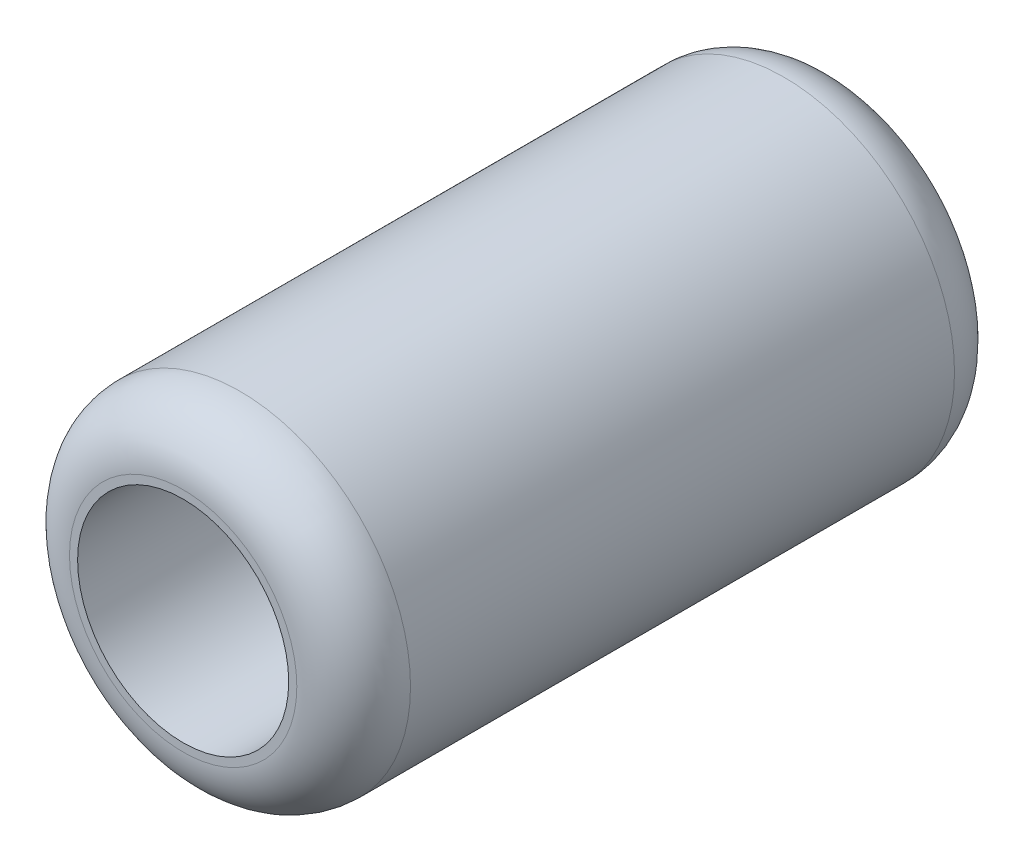
ISO-10303-21;
HEADER;
FILE_DESCRIPTION(('STEP AP214'),'2;1');
FILE_NAME('part.step','',(''),(''),'','','');
FILE_SCHEMA(('AUTOMOTIVE_DESIGN { 1 0 10303 214 1 1 1 1 }'));
ENDSEC;
DATA;
#1=APPLICATION_CONTEXT('core data for automotive mechanical design processes');
#2=APPLICATION_PROTOCOL_DEFINITION('international standard','automotive_design',2000,#1);
#3=PRODUCT_CONTEXT('',#1,'mechanical');
#4=PRODUCT('Part','Part','',(#3));
#5=PRODUCT_RELATED_PRODUCT_CATEGORY('part','',(#4));
#6=PRODUCT_DEFINITION_FORMATION('','',#4);
#7=PRODUCT_DEFINITION_CONTEXT('part definition',#1,'design');
#8=PRODUCT_DEFINITION('design','',#6,#7);
#9=PRODUCT_DEFINITION_SHAPE('','',#8);
#10=(LENGTH_UNIT() NAMED_UNIT(*) SI_UNIT(.MILLI.,.METRE.));
#11=(NAMED_UNIT(*) PLANE_ANGLE_UNIT() SI_UNIT($,.RADIAN.));
#12=(NAMED_UNIT(*) SI_UNIT($,.STERADIAN.) SOLID_ANGLE_UNIT());
#13=UNCERTAINTY_MEASURE_WITH_UNIT(LENGTH_MEASURE(1.E-05),#10,'distance_accuracy_value','');
#14=(GEOMETRIC_REPRESENTATION_CONTEXT(3) GLOBAL_UNCERTAINTY_ASSIGNED_CONTEXT((#13)) GLOBAL_UNIT_ASSIGNED_CONTEXT((#10,
#11,#12)) REPRESENTATION_CONTEXT('',''));
#15=CARTESIAN_POINT('',(0.,0.,0.));
#16=DIRECTION('',(0.,0.,1.));
#17=DIRECTION('',(1.,0.,0.));
#18=AXIS2_PLACEMENT_3D('',#15,#16,#17);
#19=CARTESIAN_POINT('',(0.,0.,40.5));
#20=DIRECTION('',(0.,0.,-1.));
#21=DIRECTION('',(-1.,0.,0.));
#22=AXIS2_PLACEMENT_3D('',#19,#20,#21);
#23=CYLINDRICAL_SURFACE('',#22,10.5);
#24=CARTESIAN_POINT('',(0.,0.,3.5));
#25=DIRECTION('',(0.,0.,1.));
#26=DIRECTION('',(1.,0.,0.));
#27=AXIS2_PLACEMENT_3D('',#24,#25,#26);
#28=CIRCLE('',#27,10.5);
#29=CARTESIAN_POINT('',(10.5,0.,3.5));
#30=VERTEX_POINT('',#29);
#31=EDGE_CURVE('E46',#30,#30,#28,.T.);
#32=ORIENTED_EDGE('',*,*,#31,.T.);
#33=EDGE_LOOP('',(#32));
#34=FACE_BOUND('',#33,.T.);
#35=CARTESIAN_POINT('',(0.,0.,37.));
#36=DIRECTION('',(0.,0.,1.));
#37=DIRECTION('',(1.,0.,0.));
#38=AXIS2_PLACEMENT_3D('',#35,#36,#37);
#39=CIRCLE('',#38,10.5);
#40=CARTESIAN_POINT('',(10.5,0.,37.));
#41=VERTEX_POINT('',#40);
#42=EDGE_CURVE('E51',#41,#41,#39,.F.);
#43=ORIENTED_EDGE('',*,*,#42,.T.);
#44=EDGE_LOOP('',(#43));
#45=FACE_BOUND('',#44,.T.);
#46=ADVANCED_FACE('F31',(#34,#45),#23,.T.);
#47=CARTESIAN_POINT('',(0.,0.,40.5));
#48=DIRECTION('',(0.,0.,1.));
#49=DIRECTION('',(1.,0.,0.));
#50=AXIS2_PLACEMENT_3D('',#47,#48,#49);
#51=PLANE('',#50);
#52=CARTESIAN_POINT('',(0.,0.,40.5));
#53=DIRECTION('',(0.,0.,1.));
#54=DIRECTION('',(1.,0.,0.));
#55=AXIS2_PLACEMENT_3D('',#52,#53,#54);
#56=CIRCLE('',#55,7.);
#57=CARTESIAN_POINT('',(7.,0.,40.5));
#58=VERTEX_POINT('',#57);
#59=EDGE_CURVE('E54',#58,#58,#56,.T.);
#60=ORIENTED_EDGE('',*,*,#59,.T.);
#61=EDGE_LOOP('',(#60));
#62=FACE_BOUND('',#61,.T.);
#63=CARTESIAN_POINT('',(0.,0.,40.5));
#64=DIRECTION('',(0.,0.,1.));
#65=DIRECTION('',(1.,0.,0.));
#66=AXIS2_PLACEMENT_3D('',#63,#64,#65);
#67=CIRCLE('',#66,6.5);
#68=CARTESIAN_POINT('',(6.5,0.,40.5));
#69=VERTEX_POINT('',#68);
#70=EDGE_CURVE('E57',#69,#69,#67,.T.);
#71=ORIENTED_EDGE('',*,*,#70,.F.);
#72=EDGE_LOOP('',(#71));
#73=FACE_BOUND('',#72,.T.);
#74=ADVANCED_FACE('F63',(#62,#73),#51,.T.);
#75=CARTESIAN_POINT('',(0.,0.,0.));
#76=DIRECTION('',(0.,0.,1.));
#77=DIRECTION('',(1.,0.,0.));
#78=AXIS2_PLACEMENT_3D('',#75,#76,#77);
#79=PLANE('',#78);
#80=CARTESIAN_POINT('',(0.,0.,0.));
#81=DIRECTION('',(0.,0.,1.));
#82=DIRECTION('',(1.,0.,0.));
#83=AXIS2_PLACEMENT_3D('',#80,#81,#82);
#84=CIRCLE('',#83,7.);
#85=CARTESIAN_POINT('',(7.,0.,0.));
#86=VERTEX_POINT('',#85);
#87=EDGE_CURVE('E42',#86,#86,#84,.F.);
#88=ORIENTED_EDGE('',*,*,#87,.T.);
#89=EDGE_LOOP('',(#88));
#90=FACE_BOUND('',#89,.T.);
#91=ADVANCED_FACE('F65',(#90),#79,.F.);
#92=CARTESIAN_POINT('',(0.,0.,40.5));
#93=DIRECTION('',(0.,0.,-1.));
#94=DIRECTION('',(-1.,0.,0.));
#95=AXIS2_PLACEMENT_3D('',#92,#93,#94);
#96=CYLINDRICAL_SURFACE('',#95,6.5);
#97=CARTESIAN_POINT('',(0.,0.,5.));
#98=DIRECTION('',(0.,0.,1.));
#99=DIRECTION('',(1.,0.,0.));
#100=AXIS2_PLACEMENT_3D('',#97,#98,#99);
#101=CIRCLE('',#100,6.5);
#102=CARTESIAN_POINT('',(6.5,0.,5.));
#103=VERTEX_POINT('',#102);
#104=EDGE_CURVE('E10',#103,#103,#101,.F.);
#105=ORIENTED_EDGE('',*,*,#104,.T.);
#106=EDGE_LOOP('',(#105));
#107=FACE_BOUND('',#106,.T.);
#108=ORIENTED_EDGE('',*,*,#70,.T.);
#109=EDGE_LOOP('',(#108));
#110=FACE_BOUND('',#109,.T.);
#111=ADVANCED_FACE('F61',(#107,#110),#96,.F.);
#112=CARTESIAN_POINT('',(0.,0.,4.));
#113=DIRECTION('',(0.,0.,1.));
#114=DIRECTION('',(1.,0.,0.));
#115=AXIS2_PLACEMENT_3D('',#112,#113,#114);
#116=PLANE('',#115);
#117=CARTESIAN_POINT('',(0.,0.,4.));
#118=DIRECTION('',(0.,0.,1.));
#119=DIRECTION('',(1.,0.,0.));
#120=AXIS2_PLACEMENT_3D('',#117,#118,#119);
#121=CIRCLE('',#120,5.5);
#122=CARTESIAN_POINT('',(5.5,0.,4.));
#123=VERTEX_POINT('',#122);
#124=EDGE_CURVE('E38',#123,#123,#121,.T.);
#125=ORIENTED_EDGE('',*,*,#124,.T.);
#126=EDGE_LOOP('',(#125));
#127=FACE_BOUND('',#126,.T.);
#128=ADVANCED_FACE('F77',(#127),#116,.T.);
#129=CARTESIAN_POINT('',(0.,0.,37.));
#130=DIRECTION('',(0.,0.,1.));
#131=DIRECTION('',(1.,0.,0.));
#132=AXIS2_PLACEMENT_3D('',#129,#130,#131);
#133=TOROIDAL_SURFACE('',#132,7.,3.5);
#134=ORIENTED_EDGE('',*,*,#42,.F.);
#135=EDGE_LOOP('',(#134));
#136=FACE_BOUND('',#135,.T.);
#137=ORIENTED_EDGE('',*,*,#59,.F.);
#138=EDGE_LOOP('',(#137));
#139=FACE_BOUND('',#138,.T.);
#140=ADVANCED_FACE('F80',(#136,#139),#133,.T.);
#141=CARTESIAN_POINT('',(0.,0.,3.5));
#142=DIRECTION('',(0.,0.,1.));
#143=DIRECTION('',(1.,0.,0.));
#144=AXIS2_PLACEMENT_3D('',#141,#142,#143);
#145=TOROIDAL_SURFACE('',#144,7.,3.5);
#146=ORIENTED_EDGE('',*,*,#87,.F.);
#147=EDGE_LOOP('',(#146));
#148=FACE_BOUND('',#147,.T.);
#149=ORIENTED_EDGE('',*,*,#31,.F.);
#150=EDGE_LOOP('',(#149));
#151=FACE_BOUND('',#150,.T.);
#152=ADVANCED_FACE('F82',(#148,#151),#145,.T.);
#153=CARTESIAN_POINT('',(0.,0.,5.));
#154=DIRECTION('',(0.,0.,1.));
#155=DIRECTION('',(1.,0.,0.));
#156=AXIS2_PLACEMENT_3D('',#153,#154,#155);
#157=TOROIDAL_SURFACE('',#156,5.5,1.);
#158=ORIENTED_EDGE('',*,*,#104,.F.);
#159=EDGE_LOOP('',(#158));
#160=FACE_BOUND('',#159,.T.);
#161=ORIENTED_EDGE('',*,*,#124,.F.);
#162=EDGE_LOOP('',(#161));
#163=FACE_BOUND('',#162,.T.);
#164=ADVANCED_FACE('F33',(#160,#163),#157,.F.);
#165=CLOSED_SHELL('',(#46,#74,#91,#111,#128,#140,#152,#164));
#166=MANIFOLD_SOLID_BREP('B2',#165);
#167=ADVANCED_BREP_SHAPE_REPRESENTATION('',(#18,#166),#14);
#168=SHAPE_DEFINITION_REPRESENTATION(#9,#167);
ENDSEC;
END-ISO-10303-21;
